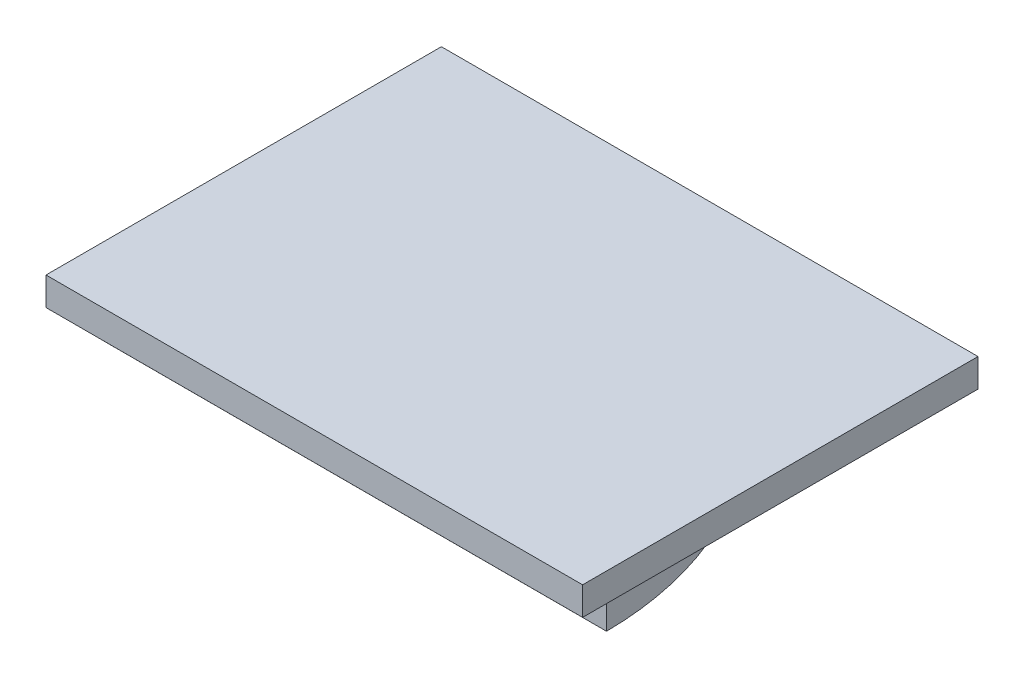
ISO-10303-21;
HEADER;
FILE_DESCRIPTION(('STEP AP214'),'2;1');
FILE_NAME('part.step','',(''),(''),'','','');
FILE_SCHEMA(('AUTOMOTIVE_DESIGN { 1 0 10303 214 1 1 1 1 }'));
ENDSEC;
DATA;
#1=APPLICATION_CONTEXT('core data for automotive mechanical design processes');
#2=APPLICATION_PROTOCOL_DEFINITION('international standard','automotive_design',2000,#1);
#3=PRODUCT_CONTEXT('',#1,'mechanical');
#4=PRODUCT('Part','Part','',(#3));
#5=PRODUCT_RELATED_PRODUCT_CATEGORY('part','',(#4));
#6=PRODUCT_DEFINITION_FORMATION('','',#4);
#7=PRODUCT_DEFINITION_CONTEXT('part definition',#1,'design');
#8=PRODUCT_DEFINITION('design','',#6,#7);
#9=PRODUCT_DEFINITION_SHAPE('','',#8);
#10=(LENGTH_UNIT() NAMED_UNIT(*) SI_UNIT(.MILLI.,.METRE.));
#11=(NAMED_UNIT(*) PLANE_ANGLE_UNIT() SI_UNIT($,.RADIAN.));
#12=(NAMED_UNIT(*) SI_UNIT($,.STERADIAN.) SOLID_ANGLE_UNIT());
#13=UNCERTAINTY_MEASURE_WITH_UNIT(LENGTH_MEASURE(1.E-05),#10,'distance_accuracy_value','');
#14=(GEOMETRIC_REPRESENTATION_CONTEXT(3) GLOBAL_UNCERTAINTY_ASSIGNED_CONTEXT((#13)) GLOBAL_UNIT_ASSIGNED_CONTEXT((#10,
#11,#12)) REPRESENTATION_CONTEXT('',''));
#15=CARTESIAN_POINT('',(0.,0.,0.));
#16=DIRECTION('',(0.,0.,1.));
#17=DIRECTION('',(1.,0.,0.));
#18=AXIS2_PLACEMENT_3D('',#15,#16,#17);
#19=CARTESIAN_POINT('',(10.7885752083275,1.4,8.54622565461706));
#20=DIRECTION('',(0.,0.,-1.));
#21=DIRECTION('',(-1.,0.,0.));
#22=AXIS2_PLACEMENT_3D('',#19,#20,#21);
#23=PLANE('',#22);
#24=DIRECTION('',(1.,0.,0.));
#25=VECTOR('',#24,1.);
#26=CARTESIAN_POINT('',(10.7885752083275,0.,8.54622565461706));
#27=LINE('',#26,#25);
#28=CARTESIAN_POINT('',(10.7885752083275,0.,8.54622565461706));
#29=VERTEX_POINT('',#28);
#30=CARTESIAN_POINT('',(28.6885752083275,0.,8.54622565461706));
#31=VERTEX_POINT('',#30);
#32=EDGE_CURVE('E118',#29,#31,#27,.T.);
#33=ORIENTED_EDGE('',*,*,#32,.T.);
#34=DIRECTION('',(0.,-1.,0.));
#35=VECTOR('',#34,1.);
#36=CARTESIAN_POINT('',(28.6885752083275,1.4,8.54622565461706));
#37=LINE('',#36,#35);
#38=CARTESIAN_POINT('',(28.6885752083275,1.4,8.54622565461706));
#39=VERTEX_POINT('',#38);
#40=EDGE_CURVE('E126',#39,#31,#37,.T.);
#41=ORIENTED_EDGE('',*,*,#40,.F.);
#42=DIRECTION('',(1.,0.,0.));
#43=VECTOR('',#42,1.);
#44=CARTESIAN_POINT('',(10.7885752083275,1.4,8.54622565461706));
#45=LINE('',#44,#43);
#46=CARTESIAN_POINT('',(10.7885752083275,1.4,8.54622565461706));
#47=VERTEX_POINT('',#46);
#48=EDGE_CURVE('E123',#47,#39,#45,.T.);
#49=ORIENTED_EDGE('',*,*,#48,.F.);
#50=DIRECTION('',(0.,-1.,0.));
#51=VECTOR('',#50,1.);
#52=CARTESIAN_POINT('',(10.7885752083275,1.4,8.54622565461706));
#53=LINE('',#52,#51);
#54=EDGE_CURVE('E131',#47,#29,#53,.T.);
#55=ORIENTED_EDGE('',*,*,#54,.T.);
#56=EDGE_LOOP('',(#33,#41,#49,#55));
#57=FACE_BOUND('',#56,.T.);
#58=ADVANCED_FACE('F33',(#57),#23,.F.);
#59=CARTESIAN_POINT('',(0.,0.,0.));
#60=DIRECTION('',(0.,1.,0.));
#61=DIRECTION('',(0.,0.,1.));
#62=AXIS2_PLACEMENT_3D('',#59,#60,#61);
#63=PLANE('',#62);
#64=ORIENTED_EDGE('',*,*,#32,.F.);
#65=CARTESIAN_POINT('',(22.7881585344267,0.,8.64622565461706));
#66=DIRECTION('',(0.,1.,0.));
#67=DIRECTION('',(0.,0.,1.));
#68=AXIS2_PLACEMENT_3D('',#65,#66,#67);
#69=CIRCLE('',#68,12.);
#70=CARTESIAN_POINT('',(19.7385752083275,0.,-2.95980904881103));
#71=VERTEX_POINT('',#70);
#72=EDGE_CURVE('E56',#29,#71,#69,.F.);
#73=ORIENTED_EDGE('',*,*,#72,.T.);
#74=CARTESIAN_POINT('',(16.6889918822282,0.,8.64622565461706));
#75=DIRECTION('',(0.,1.,0.));
#76=DIRECTION('',(0.,0.,1.));
#77=AXIS2_PLACEMENT_3D('',#74,#75,#76);
#78=CIRCLE('',#77,12.);
#79=EDGE_CURVE('E134',#71,#31,#78,.F.);
#80=ORIENTED_EDGE('',*,*,#79,.T.);
#81=EDGE_LOOP('',(#64,#73,#80));
#82=FACE_BOUND('',#81,.T.);
#83=ADVANCED_FACE('F143',(#82),#63,.F.);
#84=CARTESIAN_POINT('',(16.6889918822282,1.4,8.64622565461706));
#85=DIRECTION('',(0.,-1.,0.));
#86=DIRECTION('',(0.,0.,-1.));
#87=AXIS2_PLACEMENT_3D('',#84,#85,#86);
#88=CYLINDRICAL_SURFACE('',#87,12.);
#89=DIRECTION('',(0.,-1.,0.));
#90=VECTOR('',#89,1.);
#91=CARTESIAN_POINT('',(19.7385752083275,0.7,-2.95980904881103));
#92=LINE('',#91,#90);
#93=CARTESIAN_POINT('',(19.7385752083275,1.4,-2.95980904881103));
#94=VERTEX_POINT('',#93);
#95=EDGE_CURVE('E37',#94,#71,#92,.T.);
#96=ORIENTED_EDGE('',*,*,#95,.F.);
#97=CARTESIAN_POINT('',(16.6889918822282,1.4,8.64622565461706));
#98=DIRECTION('',(0.,1.,0.));
#99=DIRECTION('',(0.,0.,1.));
#100=AXIS2_PLACEMENT_3D('',#97,#98,#99);
#101=CIRCLE('',#100,12.);
#102=EDGE_CURVE('E42',#39,#94,#101,.T.);
#103=ORIENTED_EDGE('',*,*,#102,.F.);
#104=ORIENTED_EDGE('',*,*,#40,.T.);
#105=ORIENTED_EDGE('',*,*,#79,.F.);
#106=EDGE_LOOP('',(#96,#103,#104,#105));
#107=FACE_BOUND('',#106,.T.);
#108=ADVANCED_FACE('F35',(#107),#88,.T.);
#109=CARTESIAN_POINT('',(22.7881585344267,1.4,8.64622565461706));
#110=DIRECTION('',(0.,1.,0.));
#111=DIRECTION('',(0.,0.,1.));
#112=AXIS2_PLACEMENT_3D('',#109,#110,#111);
#113=CYLINDRICAL_SURFACE('',#112,12.);
#114=CARTESIAN_POINT('',(22.7881585344267,1.4,8.64622565461706));
#115=DIRECTION('',(0.,1.,0.));
#116=DIRECTION('',(0.,0.,1.));
#117=AXIS2_PLACEMENT_3D('',#114,#115,#116);
#118=CIRCLE('',#117,12.);
#119=EDGE_CURVE('E11',#94,#47,#118,.T.);
#120=ORIENTED_EDGE('',*,*,#119,.F.);
#121=ORIENTED_EDGE('',*,*,#95,.T.);
#122=ORIENTED_EDGE('',*,*,#72,.F.);
#123=ORIENTED_EDGE('',*,*,#54,.F.);
#124=EDGE_LOOP('',(#120,#121,#122,#123));
#125=FACE_BOUND('',#124,.T.);
#126=ADVANCED_FACE('F145',(#125),#113,.T.);
#127=CARTESIAN_POINT('',(0.,1.4,0.));
#128=DIRECTION('',(0.,1.,0.));
#129=DIRECTION('',(0.,0.,1.));
#130=AXIS2_PLACEMENT_3D('',#127,#128,#129);
#131=PLANE('',#130);
#132=DIRECTION('',(0.,0.,-1.));
#133=VECTOR('',#132,1.);
#134=CARTESIAN_POINT('',(29.2385752083275,1.4,-4.05584592580253));
#135=LINE('',#134,#133);
#136=CARTESIAN_POINT('',(29.2385752083275,1.4,9.94415407419747));
#137=VERTEX_POINT('',#136);
#138=CARTESIAN_POINT('',(29.2385752083275,1.4,-4.05584592580253));
#139=VERTEX_POINT('',#138);
#140=EDGE_CURVE('E116',#137,#139,#135,.T.);
#141=ORIENTED_EDGE('',*,*,#140,.F.);
#142=DIRECTION('',(1.,0.,0.));
#143=VECTOR('',#142,1.);
#144=CARTESIAN_POINT('',(10.2385752083275,1.4,9.94415407419747));
#145=LINE('',#144,#143);
#146=CARTESIAN_POINT('',(10.2385752083275,1.4,9.94415407419747));
#147=VERTEX_POINT('',#146);
#148=EDGE_CURVE('E112',#147,#137,#145,.T.);
#149=ORIENTED_EDGE('',*,*,#148,.F.);
#150=DIRECTION('',(0.,0.,1.));
#151=VECTOR('',#150,1.);
#152=CARTESIAN_POINT('',(10.2385752083275,1.4,-4.05584592580253));
#153=LINE('',#152,#151);
#154=CARTESIAN_POINT('',(10.2385752083275,1.4,-4.05584592580253));
#155=VERTEX_POINT('',#154);
#156=EDGE_CURVE('E234',#155,#147,#153,.T.);
#157=ORIENTED_EDGE('',*,*,#156,.F.);
#158=DIRECTION('',(-1.,0.,0.));
#159=VECTOR('',#158,1.);
#160=CARTESIAN_POINT('',(10.2385752083275,1.4,-4.05584592580253));
#161=LINE('',#160,#159);
#162=EDGE_CURVE('E237',#139,#155,#161,.T.);
#163=ORIENTED_EDGE('',*,*,#162,.F.);
#164=EDGE_LOOP('',(#141,#149,#157,#163));
#165=FACE_BOUND('',#164,.T.);
#166=ORIENTED_EDGE('',*,*,#48,.T.);
#167=ORIENTED_EDGE('',*,*,#102,.T.);
#168=ORIENTED_EDGE('',*,*,#119,.T.);
#169=EDGE_LOOP('',(#166,#167,#168));
#170=FACE_BOUND('',#169,.T.);
#171=ADVANCED_FACE('F139',(#165,#170),#131,.F.);
#172=CARTESIAN_POINT('',(29.2385752083275,2.4,-4.05584592580253));
#173=DIRECTION('',(-1.,0.,0.));
#174=DIRECTION('',(0.,0.,1.));
#175=AXIS2_PLACEMENT_3D('',#172,#173,#174);
#176=PLANE('',#175);
#177=ORIENTED_EDGE('',*,*,#140,.T.);
#178=DIRECTION('',(0.,-1.,0.));
#179=VECTOR('',#178,1.);
#180=CARTESIAN_POINT('',(29.2385752083275,2.4,-4.05584592580253));
#181=LINE('',#180,#179);
#182=CARTESIAN_POINT('',(29.2385752083275,2.4,-4.05584592580253));
#183=VERTEX_POINT('',#182);
#184=EDGE_CURVE('E96',#183,#139,#181,.T.);
#185=ORIENTED_EDGE('',*,*,#184,.F.);
#186=DIRECTION('',(0.,0.,-1.));
#187=VECTOR('',#186,1.);
#188=CARTESIAN_POINT('',(29.2385752083275,2.4,-4.05584592580253));
#189=LINE('',#188,#187);
#190=CARTESIAN_POINT('',(29.2385752083275,2.4,9.94415407419747));
#191=VERTEX_POINT('',#190);
#192=EDGE_CURVE('E103',#191,#183,#189,.T.);
#193=ORIENTED_EDGE('',*,*,#192,.F.);
#194=DIRECTION('',(0.,-1.,0.));
#195=VECTOR('',#194,1.);
#196=CARTESIAN_POINT('',(29.2385752083275,2.4,9.94415407419747));
#197=LINE('',#196,#195);
#198=EDGE_CURVE('E231',#191,#137,#197,.T.);
#199=ORIENTED_EDGE('',*,*,#198,.T.);
#200=EDGE_LOOP('',(#177,#185,#193,#199));
#201=FACE_BOUND('',#200,.T.);
#202=ADVANCED_FACE('F114',(#201),#176,.F.);
#203=CARTESIAN_POINT('',(10.2385752083275,2.4,-4.05584592580253));
#204=DIRECTION('',(0.,0.,1.));
#205=DIRECTION('',(1.,0.,0.));
#206=AXIS2_PLACEMENT_3D('',#203,#204,#205);
#207=PLANE('',#206);
#208=ORIENTED_EDGE('',*,*,#162,.T.);
#209=DIRECTION('',(0.,-1.,0.));
#210=VECTOR('',#209,1.);
#211=CARTESIAN_POINT('',(10.2385752083275,2.4,-4.05584592580253));
#212=LINE('',#211,#210);
#213=CARTESIAN_POINT('',(10.2385752083275,2.4,-4.05584592580253));
#214=VERTEX_POINT('',#213);
#215=EDGE_CURVE('E99',#214,#155,#212,.T.);
#216=ORIENTED_EDGE('',*,*,#215,.F.);
#217=DIRECTION('',(-1.,0.,0.));
#218=VECTOR('',#217,1.);
#219=CARTESIAN_POINT('',(10.2385752083275,2.4,-4.05584592580253));
#220=LINE('',#219,#218);
#221=EDGE_CURVE('E92',#183,#214,#220,.T.);
#222=ORIENTED_EDGE('',*,*,#221,.F.);
#223=ORIENTED_EDGE('',*,*,#184,.T.);
#224=EDGE_LOOP('',(#208,#216,#222,#223));
#225=FACE_BOUND('',#224,.T.);
#226=ADVANCED_FACE('F94',(#225),#207,.F.);
#227=CARTESIAN_POINT('',(10.2385752083275,2.4,-4.05584592580253));
#228=DIRECTION('',(1.,0.,0.));
#229=DIRECTION('',(0.,0.,-1.));
#230=AXIS2_PLACEMENT_3D('',#227,#228,#229);
#231=PLANE('',#230);
#232=ORIENTED_EDGE('',*,*,#156,.T.);
#233=DIRECTION('',(0.,-1.,0.));
#234=VECTOR('',#233,1.);
#235=CARTESIAN_POINT('',(10.2385752083275,2.4,9.94415407419747));
#236=LINE('',#235,#234);
#237=CARTESIAN_POINT('',(10.2385752083275,2.4,9.94415407419747));
#238=VERTEX_POINT('',#237);
#239=EDGE_CURVE('E119',#238,#147,#236,.T.);
#240=ORIENTED_EDGE('',*,*,#239,.F.);
#241=DIRECTION('',(0.,0.,1.));
#242=VECTOR('',#241,1.);
#243=CARTESIAN_POINT('',(10.2385752083275,2.4,-4.05584592580253));
#244=LINE('',#243,#242);
#245=EDGE_CURVE('E102',#214,#238,#244,.T.);
#246=ORIENTED_EDGE('',*,*,#245,.F.);
#247=ORIENTED_EDGE('',*,*,#215,.T.);
#248=EDGE_LOOP('',(#232,#240,#246,#247));
#249=FACE_BOUND('',#248,.T.);
#250=ADVANCED_FACE('F164',(#249),#231,.F.);
#251=CARTESIAN_POINT('',(10.2385752083275,2.4,9.94415407419747));
#252=DIRECTION('',(0.,0.,-1.));
#253=DIRECTION('',(-1.,0.,0.));
#254=AXIS2_PLACEMENT_3D('',#251,#252,#253);
#255=PLANE('',#254);
#256=ORIENTED_EDGE('',*,*,#148,.T.);
#257=ORIENTED_EDGE('',*,*,#198,.F.);
#258=DIRECTION('',(1.,0.,0.));
#259=VECTOR('',#258,1.);
#260=CARTESIAN_POINT('',(10.2385752083275,2.4,9.94415407419747));
#261=LINE('',#260,#259);
#262=EDGE_CURVE('E108',#238,#191,#261,.T.);
#263=ORIENTED_EDGE('',*,*,#262,.F.);
#264=ORIENTED_EDGE('',*,*,#239,.T.);
#265=EDGE_LOOP('',(#256,#257,#263,#264));
#266=FACE_BOUND('',#265,.T.);
#267=ADVANCED_FACE('F167',(#266),#255,.F.);
#268=CARTESIAN_POINT('',(0.,2.4,0.));
#269=DIRECTION('',(0.,1.,0.));
#270=DIRECTION('',(0.,0.,1.));
#271=AXIS2_PLACEMENT_3D('',#268,#269,#270);
#272=PLANE('',#271);
#273=ORIENTED_EDGE('',*,*,#192,.T.);
#274=ORIENTED_EDGE('',*,*,#221,.T.);
#275=ORIENTED_EDGE('',*,*,#245,.T.);
#276=ORIENTED_EDGE('',*,*,#262,.T.);
#277=EDGE_LOOP('',(#273,#274,#275,#276));
#278=FACE_BOUND('',#277,.T.);
#279=ADVANCED_FACE('F106',(#278),#272,.T.);
#280=CLOSED_SHELL('',(#58,#83,#108,#126,#171,#202,#226,#250,#267,#279));
#281=MANIFOLD_SOLID_BREP('B2',#280);
#282=ADVANCED_BREP_SHAPE_REPRESENTATION('',(#18,#281),#14);
#283=SHAPE_DEFINITION_REPRESENTATION(#9,#282);
ENDSEC;
END-ISO-10303-21;
